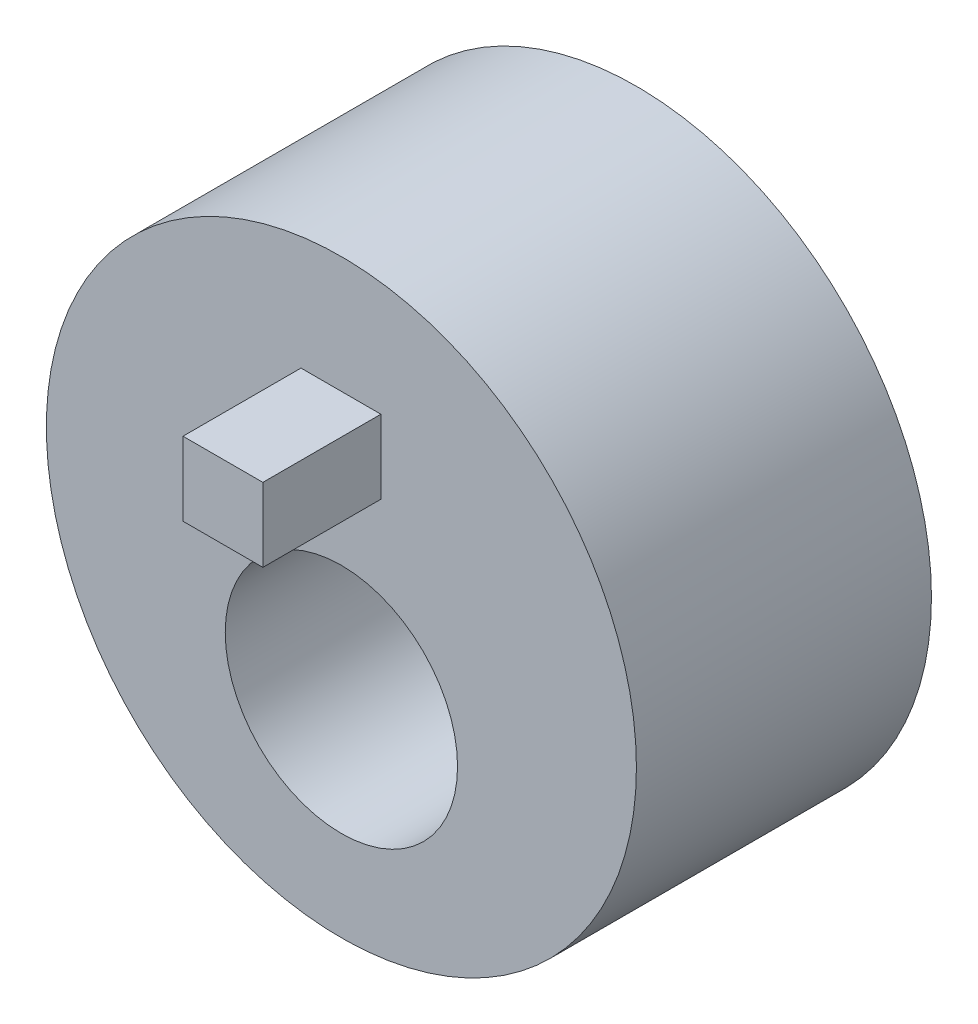
ISO-10303-21;
HEADER;
FILE_DESCRIPTION(('STEP AP214'),'2;1');
FILE_NAME('part.step','',(''),(''),'','','');
FILE_SCHEMA(('AUTOMOTIVE_DESIGN { 1 0 10303 214 1 1 1 1 }'));
ENDSEC;
DATA;
#1=APPLICATION_CONTEXT('core data for automotive mechanical design processes');
#2=APPLICATION_PROTOCOL_DEFINITION('international standard','automotive_design',2000,#1);
#3=PRODUCT_CONTEXT('',#1,'mechanical');
#4=PRODUCT('Part','Part','',(#3));
#5=PRODUCT_RELATED_PRODUCT_CATEGORY('part','',(#4));
#6=PRODUCT_DEFINITION_FORMATION('','',#4);
#7=PRODUCT_DEFINITION_CONTEXT('part definition',#1,'design');
#8=PRODUCT_DEFINITION('design','',#6,#7);
#9=PRODUCT_DEFINITION_SHAPE('','',#8);
#10=(LENGTH_UNIT() NAMED_UNIT(*) SI_UNIT(.MILLI.,.METRE.));
#11=(NAMED_UNIT(*) PLANE_ANGLE_UNIT() SI_UNIT($,.RADIAN.));
#12=(NAMED_UNIT(*) SI_UNIT($,.STERADIAN.) SOLID_ANGLE_UNIT());
#13=UNCERTAINTY_MEASURE_WITH_UNIT(LENGTH_MEASURE(1.E-05),#10,'distance_accuracy_value','');
#14=(GEOMETRIC_REPRESENTATION_CONTEXT(3) GLOBAL_UNCERTAINTY_ASSIGNED_CONTEXT((#13)) GLOBAL_UNIT_ASSIGNED_CONTEXT((#10,
#11,#12)) REPRESENTATION_CONTEXT('',''));
#15=CARTESIAN_POINT('',(0.,0.,0.));
#16=DIRECTION('',(0.,0.,1.));
#17=DIRECTION('',(1.,0.,0.));
#18=AXIS2_PLACEMENT_3D('',#15,#16,#17);
#19=CARTESIAN_POINT('',(0.,0.,6.35));
#20=DIRECTION('',(0.,0.,1.));
#21=DIRECTION('',(1.,0.,0.));
#22=AXIS2_PLACEMENT_3D('',#19,#20,#21);
#23=PLANE('',#22);
#24=CARTESIAN_POINT('',(0.,0.,6.35));
#25=DIRECTION('',(0.,0.,1.));
#26=DIRECTION('',(1.,0.,0.));
#27=AXIS2_PLACEMENT_3D('',#24,#25,#26);
#28=CIRCLE('',#27,6.35);
#29=CARTESIAN_POINT('',(6.35,0.,6.35));
#30=VERTEX_POINT('',#29);
#31=EDGE_CURVE('E11',#30,#30,#28,.T.);
#32=ORIENTED_EDGE('',*,*,#31,.T.);
#33=EDGE_LOOP('',(#32));
#34=FACE_BOUND('',#33,.T.);
#35=CARTESIAN_POINT('',(0.,-1.905,6.35));
#36=DIRECTION('',(0.,0.,1.));
#37=DIRECTION('',(1.,0.,0.));
#38=AXIS2_PLACEMENT_3D('',#35,#36,#37);
#39=CIRCLE('',#38,2.499995);
#40=CARTESIAN_POINT('',(2.499995,-1.905,6.35));
#41=VERTEX_POINT('',#40);
#42=EDGE_CURVE('E137',#41,#41,#39,.T.);
#43=ORIENTED_EDGE('',*,*,#42,.F.);
#44=EDGE_LOOP('',(#43));
#45=FACE_BOUND('',#44,.T.);
#46=DIRECTION('',(1.,0.,0.));
#47=VECTOR('',#46,1.);
#48=CARTESIAN_POINT('',(-0.869608633319308,2.25132012848223,6.35));
#49=LINE('',#48,#47);
#50=CARTESIAN_POINT('',(-0.869608633319308,2.25132012848223,6.35));
#51=VERTEX_POINT('',#50);
#52=CARTESIAN_POINT('',(0.850283997023322,2.25132012848223,6.35));
#53=VERTEX_POINT('',#52);
#54=EDGE_CURVE('E105',#51,#53,#49,.T.);
#55=ORIENTED_EDGE('',*,*,#54,.F.);
#56=DIRECTION('',(0.,-1.,0.));
#57=VECTOR('',#56,1.);
#58=CARTESIAN_POINT('',(-0.869608633319308,3.83594030475296,6.35));
#59=LINE('',#58,#57);
#60=CARTESIAN_POINT('',(-0.869608633319308,3.83594030475296,6.35));
#61=VERTEX_POINT('',#60);
#62=EDGE_CURVE('E119',#61,#51,#59,.T.);
#63=ORIENTED_EDGE('',*,*,#62,.F.);
#64=DIRECTION('',(-1.,0.,0.));
#65=VECTOR('',#64,1.);
#66=CARTESIAN_POINT('',(-0.869608633319308,3.83594030475296,6.35));
#67=LINE('',#66,#65);
#68=CARTESIAN_POINT('',(0.850283997023322,3.83594030475296,6.35));
#69=VERTEX_POINT('',#68);
#70=EDGE_CURVE('E85',#69,#61,#67,.T.);
#71=ORIENTED_EDGE('',*,*,#70,.F.);
#72=DIRECTION('',(0.,1.,0.));
#73=VECTOR('',#72,1.);
#74=CARTESIAN_POINT('',(0.850283997023322,3.83594030475296,6.35));
#75=LINE('',#74,#73);
#76=EDGE_CURVE('E125',#53,#69,#75,.T.);
#77=ORIENTED_EDGE('',*,*,#76,.F.);
#78=EDGE_LOOP('',(#55,#63,#71,#77));
#79=FACE_BOUND('',#78,.T.);
#80=ADVANCED_FACE('F47',(#34,#45,#79),#23,.T.);
#81=CARTESIAN_POINT('',(0.,0.,0.));
#82=DIRECTION('',(0.,0.,1.));
#83=DIRECTION('',(1.,0.,0.));
#84=AXIS2_PLACEMENT_3D('',#81,#82,#83);
#85=PLANE('',#84);
#86=CARTESIAN_POINT('',(0.,0.,0.));
#87=DIRECTION('',(0.,0.,1.));
#88=DIRECTION('',(1.,0.,0.));
#89=AXIS2_PLACEMENT_3D('',#86,#87,#88);
#90=CIRCLE('',#89,6.35);
#91=CARTESIAN_POINT('',(6.35,0.,0.));
#92=VERTEX_POINT('',#91);
#93=EDGE_CURVE('E51',#92,#92,#90,.T.);
#94=ORIENTED_EDGE('',*,*,#93,.F.);
#95=EDGE_LOOP('',(#94));
#96=FACE_BOUND('',#95,.T.);
#97=CARTESIAN_POINT('',(0.,-1.905,0.));
#98=DIRECTION('',(0.,0.,1.));
#99=DIRECTION('',(1.,0.,0.));
#100=AXIS2_PLACEMENT_3D('',#97,#98,#99);
#101=CIRCLE('',#100,2.499995);
#102=CARTESIAN_POINT('',(2.499995,-1.905,0.));
#103=VERTEX_POINT('',#102);
#104=EDGE_CURVE('E136',#103,#103,#101,.T.);
#105=ORIENTED_EDGE('',*,*,#104,.T.);
#106=EDGE_LOOP('',(#105));
#107=FACE_BOUND('',#106,.T.);
#108=ADVANCED_FACE('F145',(#96,#107),#85,.F.);
#109=CARTESIAN_POINT('',(0.,0.,6.35));
#110=DIRECTION('',(0.,0.,-1.));
#111=DIRECTION('',(-1.,0.,0.));
#112=AXIS2_PLACEMENT_3D('',#109,#110,#111);
#113=CYLINDRICAL_SURFACE('',#112,6.35);
#114=ORIENTED_EDGE('',*,*,#31,.F.);
#115=EDGE_LOOP('',(#114));
#116=FACE_BOUND('',#115,.T.);
#117=ORIENTED_EDGE('',*,*,#93,.T.);
#118=EDGE_LOOP('',(#117));
#119=FACE_BOUND('',#118,.T.);
#120=ADVANCED_FACE('F49',(#116,#119),#113,.T.);
#121=CARTESIAN_POINT('',(0.,-1.905,6.35));
#122=DIRECTION('',(0.,0.,-1.));
#123=DIRECTION('',(-1.,0.,0.));
#124=AXIS2_PLACEMENT_3D('',#121,#122,#123);
#125=CYLINDRICAL_SURFACE('',#124,2.499995);
#126=ORIENTED_EDGE('',*,*,#42,.T.);
#127=EDGE_LOOP('',(#126));
#128=FACE_BOUND('',#127,.T.);
#129=ORIENTED_EDGE('',*,*,#104,.F.);
#130=EDGE_LOOP('',(#129));
#131=FACE_BOUND('',#130,.T.);
#132=ADVANCED_FACE('F147',(#128,#131),#125,.F.);
#133=CARTESIAN_POINT('',(-0.869608633319308,3.83594030475296,8.89));
#134=DIRECTION('',(1.,0.,0.));
#135=DIRECTION('',(0.,0.,-1.));
#136=AXIS2_PLACEMENT_3D('',#133,#134,#135);
#137=PLANE('',#136);
#138=ORIENTED_EDGE('',*,*,#62,.T.);
#139=DIRECTION('',(0.,0.,-1.));
#140=VECTOR('',#139,1.);
#141=CARTESIAN_POINT('',(-0.869608633319308,2.25132012848223,8.89));
#142=LINE('',#141,#140);
#143=CARTESIAN_POINT('',(-0.869608633319308,2.25132012848223,8.89));
#144=VERTEX_POINT('',#143);
#145=EDGE_CURVE('E109',#144,#51,#142,.T.);
#146=ORIENTED_EDGE('',*,*,#145,.F.);
#147=DIRECTION('',(0.,-1.,0.));
#148=VECTOR('',#147,1.);
#149=CARTESIAN_POINT('',(-0.869608633319308,3.83594030475296,8.89));
#150=LINE('',#149,#148);
#151=CARTESIAN_POINT('',(-0.869608633319308,3.83594030475296,8.89));
#152=VERTEX_POINT('',#151);
#153=EDGE_CURVE('E97',#152,#144,#150,.T.);
#154=ORIENTED_EDGE('',*,*,#153,.F.);
#155=DIRECTION('',(0.,0.,-1.));
#156=VECTOR('',#155,1.);
#157=CARTESIAN_POINT('',(-0.869608633319308,3.83594030475296,8.89));
#158=LINE('',#157,#156);
#159=EDGE_CURVE('E115',#152,#61,#158,.T.);
#160=ORIENTED_EDGE('',*,*,#159,.T.);
#161=EDGE_LOOP('',(#138,#146,#154,#160));
#162=FACE_BOUND('',#161,.T.);
#163=ADVANCED_FACE('F149',(#162),#137,.F.);
#164=CARTESIAN_POINT('',(-0.869608633319308,2.25132012848223,8.89));
#165=DIRECTION('',(0.,1.,0.));
#166=DIRECTION('',(0.,0.,1.));
#167=AXIS2_PLACEMENT_3D('',#164,#165,#166);
#168=PLANE('',#167);
#169=ORIENTED_EDGE('',*,*,#54,.T.);
#170=DIRECTION('',(0.,0.,-1.));
#171=VECTOR('',#170,1.);
#172=CARTESIAN_POINT('',(0.850283997023322,2.25132012848223,8.89));
#173=LINE('',#172,#171);
#174=CARTESIAN_POINT('',(0.850283997023322,2.25132012848223,8.89));
#175=VERTEX_POINT('',#174);
#176=EDGE_CURVE('E102',#175,#53,#173,.T.);
#177=ORIENTED_EDGE('',*,*,#176,.F.);
#178=DIRECTION('',(1.,0.,0.));
#179=VECTOR('',#178,1.);
#180=CARTESIAN_POINT('',(-0.869608633319308,2.25132012848223,8.89));
#181=LINE('',#180,#179);
#182=EDGE_CURVE('E92',#144,#175,#181,.T.);
#183=ORIENTED_EDGE('',*,*,#182,.F.);
#184=ORIENTED_EDGE('',*,*,#145,.T.);
#185=EDGE_LOOP('',(#169,#177,#183,#184));
#186=FACE_BOUND('',#185,.T.);
#187=ADVANCED_FACE('F103',(#186),#168,.F.);
#188=CARTESIAN_POINT('',(0.850283997023322,3.83594030475296,8.89));
#189=DIRECTION('',(-1.,0.,0.));
#190=DIRECTION('',(0.,0.,1.));
#191=AXIS2_PLACEMENT_3D('',#188,#189,#190);
#192=PLANE('',#191);
#193=ORIENTED_EDGE('',*,*,#76,.T.);
#194=DIRECTION('',(0.,0.,-1.));
#195=VECTOR('',#194,1.);
#196=CARTESIAN_POINT('',(0.850283997023322,3.83594030475296,8.89));
#197=LINE('',#196,#195);
#198=CARTESIAN_POINT('',(0.850283997023322,3.83594030475296,8.89));
#199=VERTEX_POINT('',#198);
#200=EDGE_CURVE('E63',#199,#69,#197,.T.);
#201=ORIENTED_EDGE('',*,*,#200,.F.);
#202=DIRECTION('',(0.,1.,0.));
#203=VECTOR('',#202,1.);
#204=CARTESIAN_POINT('',(0.850283997023322,3.83594030475296,8.89));
#205=LINE('',#204,#203);
#206=EDGE_CURVE('E95',#175,#199,#205,.T.);
#207=ORIENTED_EDGE('',*,*,#206,.F.);
#208=ORIENTED_EDGE('',*,*,#176,.T.);
#209=EDGE_LOOP('',(#193,#201,#207,#208));
#210=FACE_BOUND('',#209,.T.);
#211=ADVANCED_FACE('F111',(#210),#192,.F.);
#212=CARTESIAN_POINT('',(-0.869608633319308,3.83594030475296,8.89));
#213=DIRECTION('',(0.,-1.,0.));
#214=DIRECTION('',(0.,0.,-1.));
#215=AXIS2_PLACEMENT_3D('',#212,#213,#214);
#216=PLANE('',#215);
#217=ORIENTED_EDGE('',*,*,#70,.T.);
#218=ORIENTED_EDGE('',*,*,#159,.F.);
#219=DIRECTION('',(-1.,0.,0.));
#220=VECTOR('',#219,1.);
#221=CARTESIAN_POINT('',(-0.869608633319308,3.83594030475296,8.89));
#222=LINE('',#221,#220);
#223=EDGE_CURVE('E71',#199,#152,#222,.T.);
#224=ORIENTED_EDGE('',*,*,#223,.F.);
#225=ORIENTED_EDGE('',*,*,#200,.T.);
#226=EDGE_LOOP('',(#217,#218,#224,#225));
#227=FACE_BOUND('',#226,.T.);
#228=ADVANCED_FACE('F171',(#227),#216,.F.);
#229=CARTESIAN_POINT('',(0.,0.,8.89));
#230=DIRECTION('',(0.,0.,1.));
#231=DIRECTION('',(1.,0.,0.));
#232=AXIS2_PLACEMENT_3D('',#229,#230,#231);
#233=PLANE('',#232);
#234=ORIENTED_EDGE('',*,*,#153,.T.);
#235=ORIENTED_EDGE('',*,*,#182,.T.);
#236=ORIENTED_EDGE('',*,*,#206,.T.);
#237=ORIENTED_EDGE('',*,*,#223,.T.);
#238=EDGE_LOOP('',(#234,#235,#236,#237));
#239=FACE_BOUND('',#238,.T.);
#240=ADVANCED_FACE('F93',(#239),#233,.T.);
#241=CLOSED_SHELL('',(#80,#108,#120,#132,#163,#187,#211,#228,#240));
#242=MANIFOLD_SOLID_BREP('B2',#241);
#243=ADVANCED_BREP_SHAPE_REPRESENTATION('',(#18,#242),#14);
#244=SHAPE_DEFINITION_REPRESENTATION(#9,#243);
ENDSEC;
END-ISO-10303-21;
